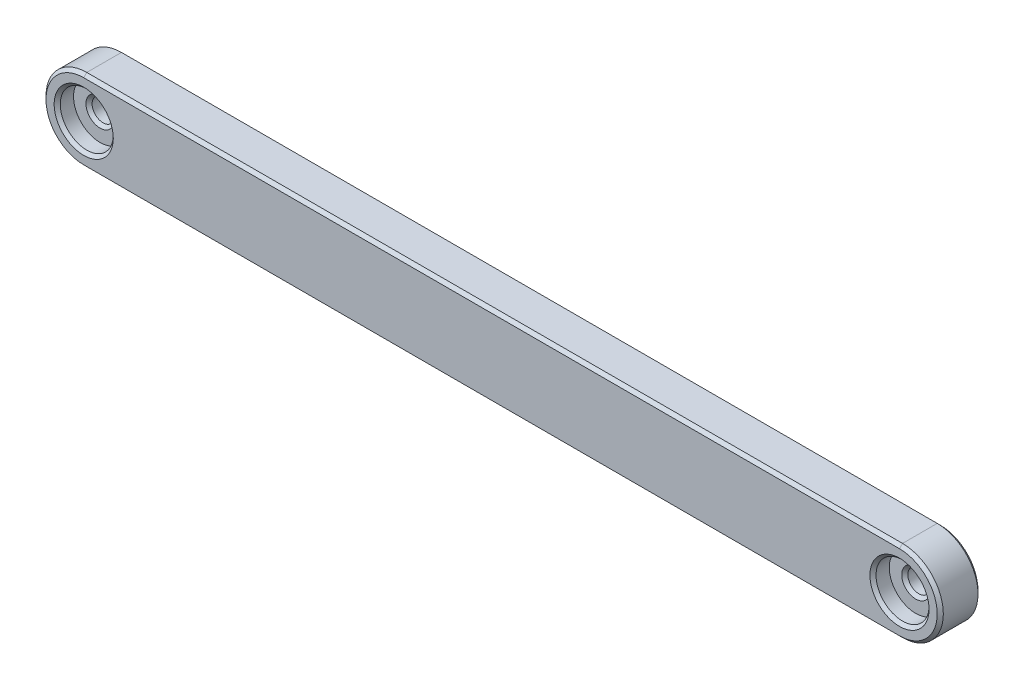
ISO-10303-21;
HEADER;
FILE_DESCRIPTION(('STEP AP214'),'2;1');
FILE_NAME('part.step','',(''),(''),'','','');
FILE_SCHEMA(('AUTOMOTIVE_DESIGN { 1 0 10303 214 1 1 1 1 }'));
ENDSEC;
DATA;
#1=APPLICATION_CONTEXT('core data for automotive mechanical design processes');
#2=APPLICATION_PROTOCOL_DEFINITION('international standard','automotive_design',2000,#1);
#3=PRODUCT_CONTEXT('',#1,'mechanical');
#4=PRODUCT('Part','Part','',(#3));
#5=PRODUCT_RELATED_PRODUCT_CATEGORY('part','',(#4));
#6=PRODUCT_DEFINITION_FORMATION('','',#4);
#7=PRODUCT_DEFINITION_CONTEXT('part definition',#1,'design');
#8=PRODUCT_DEFINITION('design','',#6,#7);
#9=PRODUCT_DEFINITION_SHAPE('','',#8);
#10=(LENGTH_UNIT() NAMED_UNIT(*) SI_UNIT(.MILLI.,.METRE.));
#11=(NAMED_UNIT(*) PLANE_ANGLE_UNIT() SI_UNIT($,.RADIAN.));
#12=(NAMED_UNIT(*) SI_UNIT($,.STERADIAN.) SOLID_ANGLE_UNIT());
#13=UNCERTAINTY_MEASURE_WITH_UNIT(LENGTH_MEASURE(1.E-05),#10,'distance_accuracy_value','');
#14=(GEOMETRIC_REPRESENTATION_CONTEXT(3) GLOBAL_UNCERTAINTY_ASSIGNED_CONTEXT((#13)) GLOBAL_UNIT_ASSIGNED_CONTEXT((#10,
#11,#12)) REPRESENTATION_CONTEXT('',''));
#15=CARTESIAN_POINT('',(0.,0.,0.));
#16=DIRECTION('',(0.,0.,1.));
#17=DIRECTION('',(1.,0.,0.));
#18=AXIS2_PLACEMENT_3D('',#15,#16,#17);
#19=CARTESIAN_POINT('',(100.,0.,10.));
#20=DIRECTION('',(0.,0.,-1.));
#21=DIRECTION('',(-1.,0.,0.));
#22=AXIS2_PLACEMENT_3D('',#19,#20,#21);
#23=CYLINDRICAL_SURFACE('',#22,2.7);
#24=CARTESIAN_POINT('',(100.,0.,5.24999999999998));
#25=DIRECTION('',(0.,0.,1.));
#26=DIRECTION('',(1.,0.,0.));
#27=AXIS2_PLACEMENT_3D('',#24,#25,#26);
#28=CIRCLE('',#27,2.7);
#29=CARTESIAN_POINT('',(102.7,0.,5.24999999999998));
#30=VERTEX_POINT('',#29);
#31=EDGE_CURVE('E197',#30,#30,#28,.T.);
#32=ORIENTED_EDGE('',*,*,#31,.T.);
#33=EDGE_LOOP('',(#32));
#34=FACE_BOUND('',#33,.T.);
#35=CARTESIAN_POINT('',(100.,0.,0.749999999999992));
#36=DIRECTION('',(0.,0.,1.));
#37=DIRECTION('',(1.,0.,0.));
#38=AXIS2_PLACEMENT_3D('',#35,#36,#37);
#39=CIRCLE('',#38,2.7);
#40=CARTESIAN_POINT('',(102.7,0.,0.749999999999992));
#41=VERTEX_POINT('',#40);
#42=EDGE_CURVE('E194',#41,#41,#39,.F.);
#43=ORIENTED_EDGE('',*,*,#42,.T.);
#44=EDGE_LOOP('',(#43));
#45=FACE_BOUND('',#44,.T.);
#46=ADVANCED_FACE('F37',(#34,#45),#23,.F.);
#47=CARTESIAN_POINT('',(-100.,0.,10.));
#48=DIRECTION('',(0.,0.,-1.));
#49=DIRECTION('',(-1.,0.,0.));
#50=AXIS2_PLACEMENT_3D('',#47,#48,#49);
#51=CYLINDRICAL_SURFACE('',#50,2.7);
#52=CARTESIAN_POINT('',(-100.,0.,5.24999999999998));
#53=DIRECTION('',(0.,0.,1.));
#54=DIRECTION('',(1.,0.,0.));
#55=AXIS2_PLACEMENT_3D('',#52,#53,#54);
#56=CIRCLE('',#55,2.7);
#57=CARTESIAN_POINT('',(-97.3,0.,5.24999999999998));
#58=VERTEX_POINT('',#57);
#59=EDGE_CURVE('E188',#58,#58,#56,.T.);
#60=ORIENTED_EDGE('',*,*,#59,.T.);
#61=EDGE_LOOP('',(#60));
#62=FACE_BOUND('',#61,.T.);
#63=CARTESIAN_POINT('',(-100.,0.,0.749999999999992));
#64=DIRECTION('',(0.,0.,1.));
#65=DIRECTION('',(1.,0.,0.));
#66=AXIS2_PLACEMENT_3D('',#63,#64,#65);
#67=CIRCLE('',#66,2.7);
#68=CARTESIAN_POINT('',(-97.3,0.,0.749999999999992));
#69=VERTEX_POINT('',#68);
#70=EDGE_CURVE('E185',#69,#69,#67,.F.);
#71=ORIENTED_EDGE('',*,*,#70,.T.);
#72=EDGE_LOOP('',(#71));
#73=FACE_BOUND('',#72,.T.);
#74=ADVANCED_FACE('F261',(#62,#73),#51,.F.);
#75=CARTESIAN_POINT('',(0.,9.99999999999998,10.));
#76=DIRECTION('',(0.,1.,0.));
#77=DIRECTION('',(0.,0.,1.));
#78=AXIS2_PLACEMENT_3D('',#75,#76,#77);
#79=PLANE('',#78);
#80=DIRECTION('',(0.,0.,-1.));
#81=VECTOR('',#80,1.);
#82=CARTESIAN_POINT('',(-100.,9.99999999999998,10.));
#83=LINE('',#82,#81);
#84=CARTESIAN_POINT('',(-100.,9.99999999999998,9.25));
#85=VERTEX_POINT('',#84);
#86=CARTESIAN_POINT('',(-100.,9.99999999999998,0.750000000000001));
#87=VERTEX_POINT('',#86);
#88=EDGE_CURVE('E151',#85,#87,#83,.T.);
#89=ORIENTED_EDGE('',*,*,#88,.F.);
#90=DIRECTION('',(1.,0.,0.));
#91=VECTOR('',#90,1.);
#92=CARTESIAN_POINT('',(0.,9.99999999999998,9.25));
#93=LINE('',#92,#91);
#94=CARTESIAN_POINT('',(100.,9.99999999999998,9.25));
#95=VERTEX_POINT('',#94);
#96=EDGE_CURVE('E170',#85,#95,#93,.T.);
#97=ORIENTED_EDGE('',*,*,#96,.T.);
#98=DIRECTION('',(0.,0.,-1.));
#99=VECTOR('',#98,1.);
#100=CARTESIAN_POINT('',(100.,9.99999999999998,10.));
#101=LINE('',#100,#99);
#102=CARTESIAN_POINT('',(100.,9.99999999999998,0.750000000000001));
#103=VERTEX_POINT('',#102);
#104=EDGE_CURVE('E114',#95,#103,#101,.T.);
#105=ORIENTED_EDGE('',*,*,#104,.T.);
#106=DIRECTION('',(-1.,0.,0.));
#107=VECTOR('',#106,1.);
#108=CARTESIAN_POINT('',(-100.,9.99999999999998,0.750000000000001));
#109=LINE('',#108,#107);
#110=EDGE_CURVE('E119',#103,#87,#109,.T.);
#111=ORIENTED_EDGE('',*,*,#110,.T.);
#112=EDGE_LOOP('',(#89,#97,#105,#111));
#113=FACE_BOUND('',#112,.T.);
#114=ADVANCED_FACE('F230',(#113),#79,.T.);
#115=CARTESIAN_POINT('',(-100.,0.,10.));
#116=DIRECTION('',(0.,0.,-1.));
#117=DIRECTION('',(-1.,0.,0.));
#118=AXIS2_PLACEMENT_3D('',#115,#116,#117);
#119=CYLINDRICAL_SURFACE('',#118,10.);
#120=DIRECTION('',(0.,0.,-1.));
#121=VECTOR('',#120,1.);
#122=CARTESIAN_POINT('',(-100.,-10.,10.));
#123=LINE('',#122,#121);
#124=CARTESIAN_POINT('',(-100.,-10.,9.25));
#125=VERTEX_POINT('',#124);
#126=CARTESIAN_POINT('',(-100.,-10.,0.750000000000001));
#127=VERTEX_POINT('',#126);
#128=EDGE_CURVE('E131',#125,#127,#123,.T.);
#129=ORIENTED_EDGE('',*,*,#128,.F.);
#130=CARTESIAN_POINT('',(-100.,0.,9.25));
#131=DIRECTION('',(0.,0.,1.));
#132=DIRECTION('',(1.,0.,0.));
#133=AXIS2_PLACEMENT_3D('',#130,#131,#132);
#134=CIRCLE('',#133,10.);
#135=EDGE_CURVE('E166',#125,#85,#134,.F.);
#136=ORIENTED_EDGE('',*,*,#135,.T.);
#137=ORIENTED_EDGE('',*,*,#88,.T.);
#138=CARTESIAN_POINT('',(-100.,0.,0.750000000000001));
#139=DIRECTION('',(0.,0.,1.));
#140=DIRECTION('',(1.,0.,0.));
#141=AXIS2_PLACEMENT_3D('',#138,#139,#140);
#142=CIRCLE('',#141,10.);
#143=EDGE_CURVE('E164',#87,#127,#142,.T.);
#144=ORIENTED_EDGE('',*,*,#143,.T.);
#145=EDGE_LOOP('',(#129,#136,#137,#144));
#146=FACE_BOUND('',#145,.T.);
#147=ADVANCED_FACE('F233',(#146),#119,.T.);
#148=CARTESIAN_POINT('',(0.,-10.,10.));
#149=DIRECTION('',(0.,-1.,0.));
#150=DIRECTION('',(1.,0.,0.));
#151=AXIS2_PLACEMENT_3D('',#148,#149,#150);
#152=PLANE('',#151);
#153=DIRECTION('',(0.,0.,-1.));
#154=VECTOR('',#153,1.);
#155=CARTESIAN_POINT('',(100.,-10.,10.));
#156=LINE('',#155,#154);
#157=CARTESIAN_POINT('',(100.,-10.,9.25));
#158=VERTEX_POINT('',#157);
#159=CARTESIAN_POINT('',(100.,-10.,0.750000000000001));
#160=VERTEX_POINT('',#159);
#161=EDGE_CURVE('E112',#158,#160,#156,.T.);
#162=ORIENTED_EDGE('',*,*,#161,.F.);
#163=DIRECTION('',(-1.,0.,0.));
#164=VECTOR('',#163,1.);
#165=CARTESIAN_POINT('',(0.,-10.,9.25));
#166=LINE('',#165,#164);
#167=EDGE_CURVE('E128',#158,#125,#166,.T.);
#168=ORIENTED_EDGE('',*,*,#167,.T.);
#169=ORIENTED_EDGE('',*,*,#128,.T.);
#170=DIRECTION('',(1.,0.,0.));
#171=VECTOR('',#170,1.);
#172=CARTESIAN_POINT('',(100.,-10.,0.750000000000001));
#173=LINE('',#172,#171);
#174=EDGE_CURVE('E130',#127,#160,#173,.T.);
#175=ORIENTED_EDGE('',*,*,#174,.T.);
#176=EDGE_LOOP('',(#162,#168,#169,#175));
#177=FACE_BOUND('',#176,.T.);
#178=ADVANCED_FACE('F125',(#177),#152,.T.);
#179=CARTESIAN_POINT('',(100.,0.,10.));
#180=DIRECTION('',(0.,0.,-1.));
#181=DIRECTION('',(-1.,0.,0.));
#182=AXIS2_PLACEMENT_3D('',#179,#180,#181);
#183=CYLINDRICAL_SURFACE('',#182,9.99999999999998);
#184=ORIENTED_EDGE('',*,*,#104,.F.);
#185=CARTESIAN_POINT('',(100.,0.,9.25));
#186=DIRECTION('',(0.,0.,1.));
#187=DIRECTION('',(1.,0.,0.));
#188=AXIS2_PLACEMENT_3D('',#185,#186,#187);
#189=CIRCLE('',#188,9.99999999999998);
#190=EDGE_CURVE('E109',#95,#158,#189,.F.);
#191=ORIENTED_EDGE('',*,*,#190,.T.);
#192=ORIENTED_EDGE('',*,*,#161,.T.);
#193=CARTESIAN_POINT('',(100.,0.,0.750000000000001));
#194=DIRECTION('',(0.,0.,1.));
#195=DIRECTION('',(1.,0.,0.));
#196=AXIS2_PLACEMENT_3D('',#193,#194,#195);
#197=CIRCLE('',#196,9.99999999999998);
#198=EDGE_CURVE('E120',#160,#103,#197,.T.);
#199=ORIENTED_EDGE('',*,*,#198,.T.);
#200=EDGE_LOOP('',(#184,#191,#192,#199));
#201=FACE_BOUND('',#200,.T.);
#202=ADVANCED_FACE('F111',(#201),#183,.T.);
#203=CARTESIAN_POINT('',(0.,0.,10.));
#204=DIRECTION('',(0.,0.,1.));
#205=DIRECTION('',(1.,0.,0.));
#206=AXIS2_PLACEMENT_3D('',#203,#204,#205);
#207=PLANE('',#206);
#208=CARTESIAN_POINT('',(-100.,0.,10.));
#209=DIRECTION('',(0.,0.,1.));
#210=DIRECTION('',(1.,0.,0.));
#211=AXIS2_PLACEMENT_3D('',#208,#209,#210);
#212=CIRCLE('',#211,9.25);
#213=CARTESIAN_POINT('',(-100.,9.24999999999998,10.));
#214=VERTEX_POINT('',#213);
#215=CARTESIAN_POINT('',(-100.,-9.25000000000002,10.));
#216=VERTEX_POINT('',#215);
#217=EDGE_CURVE('E160',#214,#216,#212,.T.);
#218=ORIENTED_EDGE('',*,*,#217,.T.);
#219=DIRECTION('',(1.,0.,0.));
#220=VECTOR('',#219,1.);
#221=CARTESIAN_POINT('',(0.,-9.25000000000001,10.));
#222=LINE('',#221,#220);
#223=CARTESIAN_POINT('',(100.,-9.24999999999998,10.));
#224=VERTEX_POINT('',#223);
#225=EDGE_CURVE('E162',#216,#224,#222,.T.);
#226=ORIENTED_EDGE('',*,*,#225,.T.);
#227=CARTESIAN_POINT('',(100.,0.,10.));
#228=DIRECTION('',(0.,0.,1.));
#229=DIRECTION('',(1.,0.,0.));
#230=AXIS2_PLACEMENT_3D('',#227,#228,#229);
#231=CIRCLE('',#230,9.24999999999998);
#232=CARTESIAN_POINT('',(100.,9.24999999999998,10.));
#233=VERTEX_POINT('',#232);
#234=EDGE_CURVE('E136',#224,#233,#231,.T.);
#235=ORIENTED_EDGE('',*,*,#234,.T.);
#236=DIRECTION('',(-1.,0.,0.));
#237=VECTOR('',#236,1.);
#238=CARTESIAN_POINT('',(0.,9.24999999999998,10.));
#239=LINE('',#238,#237);
#240=EDGE_CURVE('E157',#233,#214,#239,.T.);
#241=ORIENTED_EDGE('',*,*,#240,.T.);
#242=EDGE_LOOP('',(#218,#226,#235,#241));
#243=FACE_BOUND('',#242,.T.);
#244=CARTESIAN_POINT('',(100.,0.,10.));
#245=DIRECTION('',(0.,0.,1.));
#246=DIRECTION('',(1.,0.,0.));
#247=AXIS2_PLACEMENT_3D('',#244,#245,#246);
#248=CIRCLE('',#247,7.25000000000001);
#249=CARTESIAN_POINT('',(107.25,0.,10.));
#250=VERTEX_POINT('',#249);
#251=EDGE_CURVE('E149',#250,#250,#248,.F.);
#252=ORIENTED_EDGE('',*,*,#251,.T.);
#253=EDGE_LOOP('',(#252));
#254=FACE_BOUND('',#253,.T.);
#255=CARTESIAN_POINT('',(-100.,0.,10.));
#256=DIRECTION('',(0.,0.,1.));
#257=DIRECTION('',(1.,0.,0.));
#258=AXIS2_PLACEMENT_3D('',#255,#256,#257);
#259=CIRCLE('',#258,7.25000000000001);
#260=CARTESIAN_POINT('',(-92.75,0.,10.));
#261=VERTEX_POINT('',#260);
#262=EDGE_CURVE('E146',#261,#261,#259,.F.);
#263=ORIENTED_EDGE('',*,*,#262,.T.);
#264=EDGE_LOOP('',(#263));
#265=FACE_BOUND('',#264,.T.);
#266=ADVANCED_FACE('F368',(#243,#254,#265),#207,.T.);
#267=CARTESIAN_POINT('',(0.,0.,0.));
#268=DIRECTION('',(0.,0.,1.));
#269=DIRECTION('',(1.,0.,0.));
#270=AXIS2_PLACEMENT_3D('',#267,#268,#269);
#271=PLANE('',#270);
#272=CARTESIAN_POINT('',(100.,0.,0.));
#273=DIRECTION('',(0.,0.,1.));
#274=DIRECTION('',(1.,0.,0.));
#275=AXIS2_PLACEMENT_3D('',#272,#273,#274);
#276=CIRCLE('',#275,9.24999999999998);
#277=CARTESIAN_POINT('',(100.,9.24999999999998,0.));
#278=VERTEX_POINT('',#277);
#279=CARTESIAN_POINT('',(100.,-9.24999999999998,0.));
#280=VERTEX_POINT('',#279);
#281=EDGE_CURVE('E63',#278,#280,#276,.F.);
#282=ORIENTED_EDGE('',*,*,#281,.T.);
#283=DIRECTION('',(-1.,0.,0.));
#284=VECTOR('',#283,1.);
#285=CARTESIAN_POINT('',(-100.,-9.25000000000002,0.));
#286=LINE('',#285,#284);
#287=CARTESIAN_POINT('',(-100.,-9.25000000000002,0.));
#288=VERTEX_POINT('',#287);
#289=EDGE_CURVE('E183',#280,#288,#286,.T.);
#290=ORIENTED_EDGE('',*,*,#289,.T.);
#291=CARTESIAN_POINT('',(-100.,0.,0.));
#292=DIRECTION('',(0.,0.,1.));
#293=DIRECTION('',(1.,0.,0.));
#294=AXIS2_PLACEMENT_3D('',#291,#292,#293);
#295=CIRCLE('',#294,9.25);
#296=CARTESIAN_POINT('',(-100.,9.24999999999998,0.));
#297=VERTEX_POINT('',#296);
#298=EDGE_CURVE('E181',#288,#297,#295,.F.);
#299=ORIENTED_EDGE('',*,*,#298,.T.);
#300=DIRECTION('',(1.,0.,0.));
#301=VECTOR('',#300,1.);
#302=CARTESIAN_POINT('',(100.,9.24999999999998,0.));
#303=LINE('',#302,#301);
#304=EDGE_CURVE('E178',#297,#278,#303,.T.);
#305=ORIENTED_EDGE('',*,*,#304,.T.);
#306=EDGE_LOOP('',(#282,#290,#299,#305));
#307=FACE_BOUND('',#306,.T.);
#308=CARTESIAN_POINT('',(-100.,0.,0.));
#309=DIRECTION('',(0.,0.,1.));
#310=DIRECTION('',(1.,0.,0.));
#311=AXIS2_PLACEMENT_3D('',#308,#309,#310);
#312=CIRCLE('',#311,3.44999999999998);
#313=CARTESIAN_POINT('',(-96.55,0.,0.));
#314=VERTEX_POINT('',#313);
#315=EDGE_CURVE('E175',#314,#314,#312,.T.);
#316=ORIENTED_EDGE('',*,*,#315,.T.);
#317=EDGE_LOOP('',(#316));
#318=FACE_BOUND('',#317,.T.);
#319=CARTESIAN_POINT('',(100.,0.,0.));
#320=DIRECTION('',(0.,0.,1.));
#321=DIRECTION('',(1.,0.,0.));
#322=AXIS2_PLACEMENT_3D('',#319,#320,#321);
#323=CIRCLE('',#322,3.44999999999998);
#324=CARTESIAN_POINT('',(103.45,0.,0.));
#325=VERTEX_POINT('',#324);
#326=EDGE_CURVE('E172',#325,#325,#323,.T.);
#327=ORIENTED_EDGE('',*,*,#326,.T.);
#328=EDGE_LOOP('',(#327));
#329=FACE_BOUND('',#328,.T.);
#330=ADVANCED_FACE('F361',(#307,#318,#329),#271,.F.);
#331=CARTESIAN_POINT('',(100.,0.,6.));
#332=DIRECTION('',(0.,0.,1.));
#333=DIRECTION('',(1.,0.,0.));
#334=AXIS2_PLACEMENT_3D('',#331,#332,#333);
#335=CYLINDRICAL_SURFACE('',#334,6.5);
#336=CARTESIAN_POINT('',(100.,0.,9.24999999999999));
#337=DIRECTION('',(0.,0.,1.));
#338=DIRECTION('',(1.,0.,0.));
#339=AXIS2_PLACEMENT_3D('',#336,#337,#338);
#340=CIRCLE('',#339,6.5);
#341=CARTESIAN_POINT('',(106.5,0.,9.24999999999999));
#342=VERTEX_POINT('',#341);
#343=EDGE_CURVE('E47',#342,#342,#340,.T.);
#344=ORIENTED_EDGE('',*,*,#343,.T.);
#345=EDGE_LOOP('',(#344));
#346=FACE_BOUND('',#345,.T.);
#347=CARTESIAN_POINT('',(100.,0.,6.));
#348=DIRECTION('',(0.,0.,1.));
#349=DIRECTION('',(1.,0.,0.));
#350=AXIS2_PLACEMENT_3D('',#347,#348,#349);
#351=CIRCLE('',#350,6.5);
#352=CARTESIAN_POINT('',(106.5,0.,6.));
#353=VERTEX_POINT('',#352);
#354=EDGE_CURVE('E210',#353,#353,#351,.T.);
#355=ORIENTED_EDGE('',*,*,#354,.F.);
#356=EDGE_LOOP('',(#355));
#357=FACE_BOUND('',#356,.T.);
#358=ADVANCED_FACE('F257',(#346,#357),#335,.F.);
#359=CARTESIAN_POINT('',(100.,0.,6.));
#360=DIRECTION('',(0.,0.,1.));
#361=DIRECTION('',(1.,0.,0.));
#362=AXIS2_PLACEMENT_3D('',#359,#360,#361);
#363=PLANE('',#362);
#364=CARTESIAN_POINT('',(100.,0.,6.));
#365=DIRECTION('',(0.,0.,1.));
#366=DIRECTION('',(1.,0.,0.));
#367=AXIS2_PLACEMENT_3D('',#364,#365,#366);
#368=CIRCLE('',#367,3.45000000000001);
#369=CARTESIAN_POINT('',(103.45,0.,6.));
#370=VERTEX_POINT('',#369);
#371=EDGE_CURVE('E200',#370,#370,#368,.F.);
#372=ORIENTED_EDGE('',*,*,#371,.T.);
#373=EDGE_LOOP('',(#372));
#374=FACE_BOUND('',#373,.T.);
#375=ORIENTED_EDGE('',*,*,#354,.T.);
#376=EDGE_LOOP('',(#375));
#377=FACE_BOUND('',#376,.T.);
#378=ADVANCED_FACE('F247',(#374,#377),#363,.T.);
#379=CARTESIAN_POINT('',(-100.,0.,6.));
#380=DIRECTION('',(0.,0.,1.));
#381=DIRECTION('',(1.,0.,0.));
#382=AXIS2_PLACEMENT_3D('',#379,#380,#381);
#383=CYLINDRICAL_SURFACE('',#382,6.5);
#384=CARTESIAN_POINT('',(-100.,0.,9.24999999999999));
#385=DIRECTION('',(0.,0.,1.));
#386=DIRECTION('',(1.,0.,0.));
#387=AXIS2_PLACEMENT_3D('',#384,#385,#386);
#388=CIRCLE('',#387,6.5);
#389=CARTESIAN_POINT('',(-93.5,0.,9.24999999999999));
#390=VERTEX_POINT('',#389);
#391=EDGE_CURVE('E11',#390,#390,#388,.T.);
#392=ORIENTED_EDGE('',*,*,#391,.T.);
#393=EDGE_LOOP('',(#392));
#394=FACE_BOUND('',#393,.T.);
#395=CARTESIAN_POINT('',(-100.,0.,6.));
#396=DIRECTION('',(0.,0.,1.));
#397=DIRECTION('',(1.,0.,0.));
#398=AXIS2_PLACEMENT_3D('',#395,#396,#397);
#399=CIRCLE('',#398,6.5);
#400=CARTESIAN_POINT('',(-93.5,0.,6.));
#401=VERTEX_POINT('',#400);
#402=EDGE_CURVE('E237',#401,#401,#399,.T.);
#403=ORIENTED_EDGE('',*,*,#402,.F.);
#404=EDGE_LOOP('',(#403));
#405=FACE_BOUND('',#404,.T.);
#406=ADVANCED_FACE('F245',(#394,#405),#383,.F.);
#407=CARTESIAN_POINT('',(-100.,0.,6.));
#408=DIRECTION('',(0.,0.,1.));
#409=DIRECTION('',(1.,0.,0.));
#410=AXIS2_PLACEMENT_3D('',#407,#408,#409);
#411=PLANE('',#410);
#412=CARTESIAN_POINT('',(-100.,0.,6.));
#413=DIRECTION('',(0.,0.,1.));
#414=DIRECTION('',(1.,0.,0.));
#415=AXIS2_PLACEMENT_3D('',#412,#413,#414);
#416=CIRCLE('',#415,3.45000000000001);
#417=CARTESIAN_POINT('',(-96.55,0.,6.));
#418=VERTEX_POINT('',#417);
#419=EDGE_CURVE('E191',#418,#418,#416,.F.);
#420=ORIENTED_EDGE('',*,*,#419,.T.);
#421=EDGE_LOOP('',(#420));
#422=FACE_BOUND('',#421,.T.);
#423=ORIENTED_EDGE('',*,*,#402,.T.);
#424=EDGE_LOOP('',(#423));
#425=FACE_BOUND('',#424,.T.);
#426=ADVANCED_FACE('F243',(#422,#425),#411,.T.);
#427=CARTESIAN_POINT('',(0.,9.99999999999998,9.25));
#428=DIRECTION('',(0.,-0.707106781186547,-0.707106781186547));
#429=DIRECTION('',(1.,0.,0.));
#430=AXIS2_PLACEMENT_3D('',#427,#428,#429);
#431=PLANE('',#430);
#432=DIRECTION('',(0.,0.707106781186547,-0.707106781186547));
#433=VECTOR('',#432,1.);
#434=CARTESIAN_POINT('',(-100.,9.24999999999998,10.));
#435=LINE('',#434,#433);
#436=EDGE_CURVE('E140',#214,#85,#435,.T.);
#437=ORIENTED_EDGE('',*,*,#436,.F.);
#438=ORIENTED_EDGE('',*,*,#240,.F.);
#439=DIRECTION('',(0.,-0.707106781186547,0.707106781186547));
#440=VECTOR('',#439,1.);
#441=CARTESIAN_POINT('',(100.,9.99999999999998,9.25));
#442=LINE('',#441,#440);
#443=EDGE_CURVE('E208',#95,#233,#442,.T.);
#444=ORIENTED_EDGE('',*,*,#443,.F.);
#445=ORIENTED_EDGE('',*,*,#96,.F.);
#446=EDGE_LOOP('',(#437,#438,#444,#445));
#447=FACE_BOUND('',#446,.T.);
#448=ADVANCED_FACE('F254',(#447),#431,.F.);
#449=CARTESIAN_POINT('',(100.,0.,9.25));
#450=DIRECTION('',(0.,0.,-1.));
#451=DIRECTION('',(-1.,0.,0.));
#452=AXIS2_PLACEMENT_3D('',#449,#450,#451);
#453=CONICAL_SURFACE('',#452,9.99999999999998,0.785398163397448);
#454=ORIENTED_EDGE('',*,*,#443,.T.);
#455=ORIENTED_EDGE('',*,*,#234,.F.);
#456=DIRECTION('',(0.,0.707106781186547,0.707106781186547));
#457=VECTOR('',#456,1.);
#458=CARTESIAN_POINT('',(100.,-9.99999999999998,9.25));
#459=LINE('',#458,#457);
#460=EDGE_CURVE('E134',#158,#224,#459,.T.);
#461=ORIENTED_EDGE('',*,*,#460,.F.);
#462=ORIENTED_EDGE('',*,*,#190,.F.);
#463=EDGE_LOOP('',(#454,#455,#461,#462));
#464=FACE_BOUND('',#463,.T.);
#465=ADVANCED_FACE('F135',(#464),#453,.T.);
#466=CARTESIAN_POINT('',(-100.,0.,10.));
#467=DIRECTION('',(0.,0.,-1.));
#468=DIRECTION('',(-1.,0.,0.));
#469=AXIS2_PLACEMENT_3D('',#466,#467,#468);
#470=CONICAL_SURFACE('',#469,9.25,0.785398163397448);
#471=ORIENTED_EDGE('',*,*,#436,.T.);
#472=ORIENTED_EDGE('',*,*,#135,.F.);
#473=DIRECTION('',(0.,-0.707106781186547,-0.707106781186547));
#474=VECTOR('',#473,1.);
#475=CARTESIAN_POINT('',(-100.,-9.25000000000002,10.));
#476=LINE('',#475,#474);
#477=EDGE_CURVE('E141',#216,#125,#476,.T.);
#478=ORIENTED_EDGE('',*,*,#477,.F.);
#479=ORIENTED_EDGE('',*,*,#217,.F.);
#480=EDGE_LOOP('',(#471,#472,#478,#479));
#481=FACE_BOUND('',#480,.T.);
#482=ADVANCED_FACE('F280',(#481),#470,.T.);
#483=CARTESIAN_POINT('',(0.,-10.,9.25));
#484=DIRECTION('',(0.,0.707106781186547,-0.707106781186547));
#485=DIRECTION('',(-1.,0.,0.));
#486=AXIS2_PLACEMENT_3D('',#483,#484,#485);
#487=PLANE('',#486);
#488=ORIENTED_EDGE('',*,*,#460,.T.);
#489=ORIENTED_EDGE('',*,*,#225,.F.);
#490=ORIENTED_EDGE('',*,*,#477,.T.);
#491=ORIENTED_EDGE('',*,*,#167,.F.);
#492=EDGE_LOOP('',(#488,#489,#490,#491));
#493=FACE_BOUND('',#492,.T.);
#494=ADVANCED_FACE('F143',(#493),#487,.F.);
#495=CARTESIAN_POINT('',(0.,9.24999999999998,0.));
#496=DIRECTION('',(0.,0.707106781186547,-0.707106781186547));
#497=DIRECTION('',(-1.,0.,0.));
#498=AXIS2_PLACEMENT_3D('',#495,#496,#497);
#499=PLANE('',#498);
#500=DIRECTION('',(0.,-0.707106781186547,-0.707106781186547));
#501=VECTOR('',#500,1.);
#502=CARTESIAN_POINT('',(-100.,9.99999999999998,0.750000000000001));
#503=LINE('',#502,#501);
#504=EDGE_CURVE('E213',#87,#297,#503,.T.);
#505=ORIENTED_EDGE('',*,*,#504,.F.);
#506=ORIENTED_EDGE('',*,*,#110,.F.);
#507=DIRECTION('',(0.,0.707106781186547,0.707106781186547));
#508=VECTOR('',#507,1.);
#509=CARTESIAN_POINT('',(100.,9.24999999999998,0.));
#510=LINE('',#509,#508);
#511=EDGE_CURVE('E42',#278,#103,#510,.T.);
#512=ORIENTED_EDGE('',*,*,#511,.F.);
#513=ORIENTED_EDGE('',*,*,#304,.F.);
#514=EDGE_LOOP('',(#505,#506,#512,#513));
#515=FACE_BOUND('',#514,.T.);
#516=ADVANCED_FACE('F226',(#515),#499,.T.);
#517=CARTESIAN_POINT('',(100.,0.,0.));
#518=DIRECTION('',(0.,0.,1.));
#519=DIRECTION('',(1.,0.,0.));
#520=AXIS2_PLACEMENT_3D('',#517,#518,#519);
#521=CONICAL_SURFACE('',#520,9.24999999999998,0.785398163397448);
#522=ORIENTED_EDGE('',*,*,#511,.T.);
#523=ORIENTED_EDGE('',*,*,#198,.F.);
#524=DIRECTION('',(0.,-0.707106781186547,0.707106781186547));
#525=VECTOR('',#524,1.);
#526=CARTESIAN_POINT('',(100.,-9.24999999999998,0.));
#527=LINE('',#526,#525);
#528=EDGE_CURVE('E212',#280,#160,#527,.T.);
#529=ORIENTED_EDGE('',*,*,#528,.F.);
#530=ORIENTED_EDGE('',*,*,#281,.F.);
#531=EDGE_LOOP('',(#522,#523,#529,#530));
#532=FACE_BOUND('',#531,.T.);
#533=ADVANCED_FACE('F222',(#532),#521,.T.);
#534=CARTESIAN_POINT('',(-100.,0.,0.750000000000001));
#535=DIRECTION('',(0.,0.,1.));
#536=DIRECTION('',(1.,0.,0.));
#537=AXIS2_PLACEMENT_3D('',#534,#535,#536);
#538=CONICAL_SURFACE('',#537,10.,0.785398163397448);
#539=ORIENTED_EDGE('',*,*,#504,.T.);
#540=ORIENTED_EDGE('',*,*,#298,.F.);
#541=DIRECTION('',(0.,0.707106781186547,-0.707106781186547));
#542=VECTOR('',#541,1.);
#543=CARTESIAN_POINT('',(-100.,-10.,0.750000000000001));
#544=LINE('',#543,#542);
#545=EDGE_CURVE('E55',#127,#288,#544,.T.);
#546=ORIENTED_EDGE('',*,*,#545,.F.);
#547=ORIENTED_EDGE('',*,*,#143,.F.);
#548=EDGE_LOOP('',(#539,#540,#546,#547));
#549=FACE_BOUND('',#548,.T.);
#550=ADVANCED_FACE('F306',(#549),#538,.T.);
#551=CARTESIAN_POINT('',(0.,-9.25000000000001,0.));
#552=DIRECTION('',(0.,-0.707106781186547,-0.707106781186547));
#553=DIRECTION('',(1.,0.,0.));
#554=AXIS2_PLACEMENT_3D('',#551,#552,#553);
#555=PLANE('',#554);
#556=ORIENTED_EDGE('',*,*,#528,.T.);
#557=ORIENTED_EDGE('',*,*,#174,.F.);
#558=ORIENTED_EDGE('',*,*,#545,.T.);
#559=ORIENTED_EDGE('',*,*,#289,.F.);
#560=EDGE_LOOP('',(#556,#557,#558,#559));
#561=FACE_BOUND('',#560,.T.);
#562=ADVANCED_FACE('F298',(#561),#555,.T.);
#563=CARTESIAN_POINT('',(-100.,0.,5.24999999999998));
#564=DIRECTION('',(0.,0.,1.));
#565=DIRECTION('',(1.,0.,0.));
#566=AXIS2_PLACEMENT_3D('',#563,#564,#565);
#567=CONICAL_SURFACE('',#566,2.7,0.785398163397442);
#568=ORIENTED_EDGE('',*,*,#419,.F.);
#569=EDGE_LOOP('',(#568));
#570=FACE_BOUND('',#569,.T.);
#571=ORIENTED_EDGE('',*,*,#59,.F.);
#572=EDGE_LOOP('',(#571));
#573=FACE_BOUND('',#572,.T.);
#574=ADVANCED_FACE('F305',(#570,#573),#567,.F.);
#575=CARTESIAN_POINT('',(-100.,0.,0.));
#576=DIRECTION('',(0.,0.,-1.));
#577=DIRECTION('',(-1.,0.,0.));
#578=AXIS2_PLACEMENT_3D('',#575,#576,#577);
#579=CONICAL_SURFACE('',#578,3.44999999999998,0.785398163397443);
#580=ORIENTED_EDGE('',*,*,#70,.F.);
#581=EDGE_LOOP('',(#580));
#582=FACE_BOUND('',#581,.T.);
#583=ORIENTED_EDGE('',*,*,#315,.F.);
#584=EDGE_LOOP('',(#583));
#585=FACE_BOUND('',#584,.T.);
#586=ADVANCED_FACE('F325',(#582,#585),#579,.F.);
#587=CARTESIAN_POINT('',(100.,0.,5.24999999999998));
#588=DIRECTION('',(0.,0.,1.));
#589=DIRECTION('',(1.,0.,0.));
#590=AXIS2_PLACEMENT_3D('',#587,#588,#589);
#591=CONICAL_SURFACE('',#590,2.7,0.785398163397442);
#592=ORIENTED_EDGE('',*,*,#371,.F.);
#593=EDGE_LOOP('',(#592));
#594=FACE_BOUND('',#593,.T.);
#595=ORIENTED_EDGE('',*,*,#31,.F.);
#596=EDGE_LOOP('',(#595));
#597=FACE_BOUND('',#596,.T.);
#598=ADVANCED_FACE('F332',(#594,#597),#591,.F.);
#599=CARTESIAN_POINT('',(100.,0.,0.));
#600=DIRECTION('',(0.,0.,-1.));
#601=DIRECTION('',(-1.,0.,0.));
#602=AXIS2_PLACEMENT_3D('',#599,#600,#601);
#603=CONICAL_SURFACE('',#602,3.44999999999998,0.785398163397443);
#604=ORIENTED_EDGE('',*,*,#42,.F.);
#605=EDGE_LOOP('',(#604));
#606=FACE_BOUND('',#605,.T.);
#607=ORIENTED_EDGE('',*,*,#326,.F.);
#608=EDGE_LOOP('',(#607));
#609=FACE_BOUND('',#608,.T.);
#610=ADVANCED_FACE('F339',(#606,#609),#603,.F.);
#611=CARTESIAN_POINT('',(100.,0.,9.24999999999999));
#612=DIRECTION('',(0.,0.,1.));
#613=DIRECTION('',(1.,0.,0.));
#614=AXIS2_PLACEMENT_3D('',#611,#612,#613);
#615=CONICAL_SURFACE('',#614,6.5,0.785398163397442);
#616=ORIENTED_EDGE('',*,*,#251,.F.);
#617=EDGE_LOOP('',(#616));
#618=FACE_BOUND('',#617,.T.);
#619=ORIENTED_EDGE('',*,*,#343,.F.);
#620=EDGE_LOOP('',(#619));
#621=FACE_BOUND('',#620,.T.);
#622=ADVANCED_FACE('F345',(#618,#621),#615,.F.);
#623=CARTESIAN_POINT('',(-100.,0.,9.24999999999999));
#624=DIRECTION('',(0.,0.,1.));
#625=DIRECTION('',(1.,0.,0.));
#626=AXIS2_PLACEMENT_3D('',#623,#624,#625);
#627=CONICAL_SURFACE('',#626,6.5,0.785398163397442);
#628=ORIENTED_EDGE('',*,*,#262,.F.);
#629=EDGE_LOOP('',(#628));
#630=FACE_BOUND('',#629,.T.);
#631=ORIENTED_EDGE('',*,*,#391,.F.);
#632=EDGE_LOOP('',(#631));
#633=FACE_BOUND('',#632,.T.);
#634=ADVANCED_FACE('F40',(#630,#633),#627,.F.);
#635=CLOSED_SHELL('',(#46,#74,#114,#147,#178,#202,#266,#330,#358,#378,#406,#426,#448,#465,#482,
#494,#516,#533,#550,#562,#574,#586,#598,#610,#622,#634));
#636=MANIFOLD_SOLID_BREP('B2',#635);
#637=ADVANCED_BREP_SHAPE_REPRESENTATION('',(#18,#636),#14);
#638=SHAPE_DEFINITION_REPRESENTATION(#9,#637);
ENDSEC;
END-ISO-10303-21;
